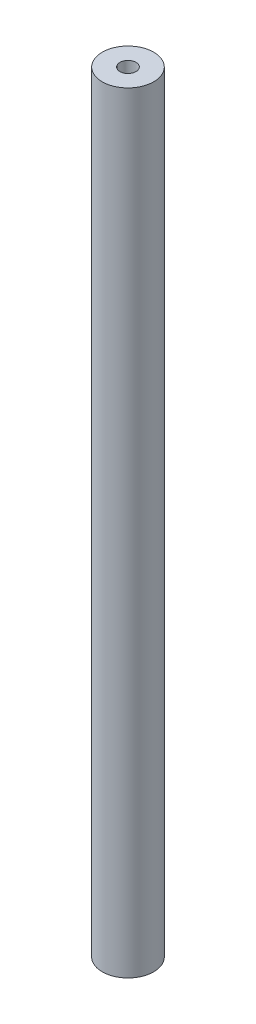
ISO-10303-21;
HEADER;
FILE_DESCRIPTION(('STEP AP214'),'2;1');
FILE_NAME('part.step','',(''),(''),'','','');
FILE_SCHEMA(('AUTOMOTIVE_DESIGN { 1 0 10303 214 1 1 1 1 }'));
ENDSEC;
DATA;
#1=APPLICATION_CONTEXT('core data for automotive mechanical design processes');
#2=APPLICATION_PROTOCOL_DEFINITION('international standard','automotive_design',2000,#1);
#3=PRODUCT_CONTEXT('',#1,'mechanical');
#4=PRODUCT('Part','Part','',(#3));
#5=PRODUCT_RELATED_PRODUCT_CATEGORY('part','',(#4));
#6=PRODUCT_DEFINITION_FORMATION('','',#4);
#7=PRODUCT_DEFINITION_CONTEXT('part definition',#1,'design');
#8=PRODUCT_DEFINITION('design','',#6,#7);
#9=PRODUCT_DEFINITION_SHAPE('','',#8);
#10=(LENGTH_UNIT() NAMED_UNIT(*) SI_UNIT(.MILLI.,.METRE.));
#11=(NAMED_UNIT(*) PLANE_ANGLE_UNIT() SI_UNIT($,.RADIAN.));
#12=(NAMED_UNIT(*) SI_UNIT($,.STERADIAN.) SOLID_ANGLE_UNIT());
#13=UNCERTAINTY_MEASURE_WITH_UNIT(LENGTH_MEASURE(1.E-05),#10,'distance_accuracy_value','');
#14=(GEOMETRIC_REPRESENTATION_CONTEXT(3) GLOBAL_UNCERTAINTY_ASSIGNED_CONTEXT((#13)) GLOBAL_UNIT_ASSIGNED_CONTEXT((#10,
#11,#12)) REPRESENTATION_CONTEXT('',''));
#15=CARTESIAN_POINT('',(0.,0.,0.));
#16=DIRECTION('',(0.,0.,1.));
#17=DIRECTION('',(1.,0.,0.));
#18=AXIS2_PLACEMENT_3D('',#15,#16,#17);
#19=CARTESIAN_POINT('',(0.,120.,0.));
#20=DIRECTION('',(0.,-1.,0.));
#21=DIRECTION('',(0.,0.,-1.));
#22=AXIS2_PLACEMENT_3D('',#19,#20,#21);
#23=CYLINDRICAL_SURFACE('',#22,8.);
#24=CARTESIAN_POINT('',(0.,120.,0.));
#25=DIRECTION('',(0.,1.,0.));
#26=DIRECTION('',(0.,0.,1.));
#27=AXIS2_PLACEMENT_3D('',#24,#25,#26);
#28=CIRCLE('',#27,8.);
#29=CARTESIAN_POINT('',(0.,120.,8.));
#30=VERTEX_POINT('',#29);
#31=EDGE_CURVE('E11',#30,#30,#28,.T.);
#32=ORIENTED_EDGE('',*,*,#31,.F.);
#33=EDGE_LOOP('',(#32));
#34=FACE_BOUND('',#33,.T.);
#35=CARTESIAN_POINT('',(0.,-120.,0.));
#36=DIRECTION('',(0.,1.,0.));
#37=DIRECTION('',(0.,0.,1.));
#38=AXIS2_PLACEMENT_3D('',#35,#36,#37);
#39=CIRCLE('',#38,8.);
#40=CARTESIAN_POINT('',(0.,-120.,8.));
#41=VERTEX_POINT('',#40);
#42=EDGE_CURVE('E48',#41,#41,#39,.T.);
#43=ORIENTED_EDGE('',*,*,#42,.T.);
#44=EDGE_LOOP('',(#43));
#45=FACE_BOUND('',#44,.T.);
#46=ADVANCED_FACE('F45',(#34,#45),#23,.T.);
#47=CARTESIAN_POINT('',(0.,120.,0.));
#48=DIRECTION('',(0.,1.,0.));
#49=DIRECTION('',(0.,0.,1.));
#50=AXIS2_PLACEMENT_3D('',#47,#48,#49);
#51=PLANE('',#50);
#52=CARTESIAN_POINT('',(0.,120.,0.));
#53=DIRECTION('',(0.,1.,0.));
#54=DIRECTION('',(0.,0.,1.));
#55=AXIS2_PLACEMENT_3D('',#52,#53,#54);
#56=CIRCLE('',#55,2.5);
#57=CARTESIAN_POINT('',(0.,120.,2.5));
#58=VERTEX_POINT('',#57);
#59=EDGE_CURVE('E72',#58,#58,#56,.T.);
#60=ORIENTED_EDGE('',*,*,#59,.F.);
#61=EDGE_LOOP('',(#60));
#62=FACE_BOUND('',#61,.T.);
#63=ORIENTED_EDGE('',*,*,#31,.T.);
#64=EDGE_LOOP('',(#63));
#65=FACE_BOUND('',#64,.T.);
#66=ADVANCED_FACE('F95',(#62,#65),#51,.T.);
#67=CARTESIAN_POINT('',(0.,-120.,0.));
#68=DIRECTION('',(0.,1.,0.));
#69=DIRECTION('',(0.,0.,1.));
#70=AXIS2_PLACEMENT_3D('',#67,#68,#69);
#71=PLANE('',#70);
#72=CARTESIAN_POINT('',(0.,-120.,0.));
#73=DIRECTION('',(0.,-1.,0.));
#74=DIRECTION('',(0.,0.,-1.));
#75=AXIS2_PLACEMENT_3D('',#72,#73,#74);
#76=CIRCLE('',#75,2.5);
#77=CARTESIAN_POINT('',(0.,-120.,-2.5));
#78=VERTEX_POINT('',#77);
#79=EDGE_CURVE('E73',#78,#78,#76,.T.);
#80=ORIENTED_EDGE('',*,*,#79,.F.);
#81=EDGE_LOOP('',(#80));
#82=FACE_BOUND('',#81,.T.);
#83=ORIENTED_EDGE('',*,*,#42,.F.);
#84=EDGE_LOOP('',(#83));
#85=FACE_BOUND('',#84,.T.);
#86=ADVANCED_FACE('F92',(#82,#85),#71,.F.);
#87=CARTESIAN_POINT('',(0.,103.,0.));
#88=DIRECTION('',(0.,1.,0.));
#89=DIRECTION('',(0.,0.,1.));
#90=AXIS2_PLACEMENT_3D('',#87,#88,#89);
#91=CONICAL_SURFACE('',#90,2.5,1.02974425867665);
#92=CARTESIAN_POINT('',(0.,101.497848452431,0.));
#93=VERTEX_POINT('',#92);
#94=VERTEX_LOOP('',#93);
#95=FACE_BOUND('',#94,.T.);
#96=CARTESIAN_POINT('',(0.,103.,0.));
#97=DIRECTION('',(0.,1.,0.));
#98=DIRECTION('',(0.,0.,1.));
#99=AXIS2_PLACEMENT_3D('',#96,#97,#98);
#100=CIRCLE('',#99,2.5);
#101=CARTESIAN_POINT('',(0.,103.,2.5));
#102=VERTEX_POINT('',#101);
#103=EDGE_CURVE('E78',#102,#102,#100,.T.);
#104=ORIENTED_EDGE('',*,*,#103,.T.);
#105=EDGE_LOOP('',(#104));
#106=FACE_BOUND('',#105,.T.);
#107=ADVANCED_FACE('F94',(#95,#106),#91,.F.);
#108=CARTESIAN_POINT('',(0.,120.,0.));
#109=DIRECTION('',(0.,1.,0.));
#110=DIRECTION('',(0.,0.,1.));
#111=AXIS2_PLACEMENT_3D('',#108,#109,#110);
#112=CYLINDRICAL_SURFACE('',#111,2.5);
#113=ORIENTED_EDGE('',*,*,#103,.F.);
#114=EDGE_LOOP('',(#113));
#115=FACE_BOUND('',#114,.T.);
#116=ORIENTED_EDGE('',*,*,#59,.T.);
#117=EDGE_LOOP('',(#116));
#118=FACE_BOUND('',#117,.T.);
#119=ADVANCED_FACE('F65',(#115,#118),#112,.F.);
#120=CARTESIAN_POINT('',(0.,-103.,0.));
#121=DIRECTION('',(0.,-1.,0.));
#122=DIRECTION('',(0.,0.,-1.));
#123=AXIS2_PLACEMENT_3D('',#120,#121,#122);
#124=CONICAL_SURFACE('',#123,2.5,1.02974425867665);
#125=CARTESIAN_POINT('',(0.,-101.497848452431,0.));
#126=VERTEX_POINT('',#125);
#127=VERTEX_LOOP('',#126);
#128=FACE_BOUND('',#127,.T.);
#129=CARTESIAN_POINT('',(0.,-103.,0.));
#130=DIRECTION('',(0.,-1.,0.));
#131=DIRECTION('',(0.,0.,-1.));
#132=AXIS2_PLACEMENT_3D('',#129,#130,#131);
#133=CIRCLE('',#132,2.5);
#134=CARTESIAN_POINT('',(0.,-103.,-2.5));
#135=VERTEX_POINT('',#134);
#136=EDGE_CURVE('E69',#135,#135,#133,.T.);
#137=ORIENTED_EDGE('',*,*,#136,.T.);
#138=EDGE_LOOP('',(#137));
#139=FACE_BOUND('',#138,.T.);
#140=ADVANCED_FACE('F61',(#128,#139),#124,.F.);
#141=CARTESIAN_POINT('',(0.,-120.,0.));
#142=DIRECTION('',(0.,-1.,0.));
#143=DIRECTION('',(0.,0.,-1.));
#144=AXIS2_PLACEMENT_3D('',#141,#142,#143);
#145=CYLINDRICAL_SURFACE('',#144,2.5);
#146=ORIENTED_EDGE('',*,*,#136,.F.);
#147=EDGE_LOOP('',(#146));
#148=FACE_BOUND('',#147,.T.);
#149=ORIENTED_EDGE('',*,*,#79,.T.);
#150=EDGE_LOOP('',(#149));
#151=FACE_BOUND('',#150,.T.);
#152=ADVANCED_FACE('F64',(#148,#151),#145,.F.);
#153=CLOSED_SHELL('',(#46,#66,#86,#107,#119,#140,#152));
#154=MANIFOLD_SOLID_BREP('B2',#153);
#155=ADVANCED_BREP_SHAPE_REPRESENTATION('',(#18,#154),#14);
#156=SHAPE_DEFINITION_REPRESENTATION(#9,#155);
ENDSEC;
END-ISO-10303-21;
